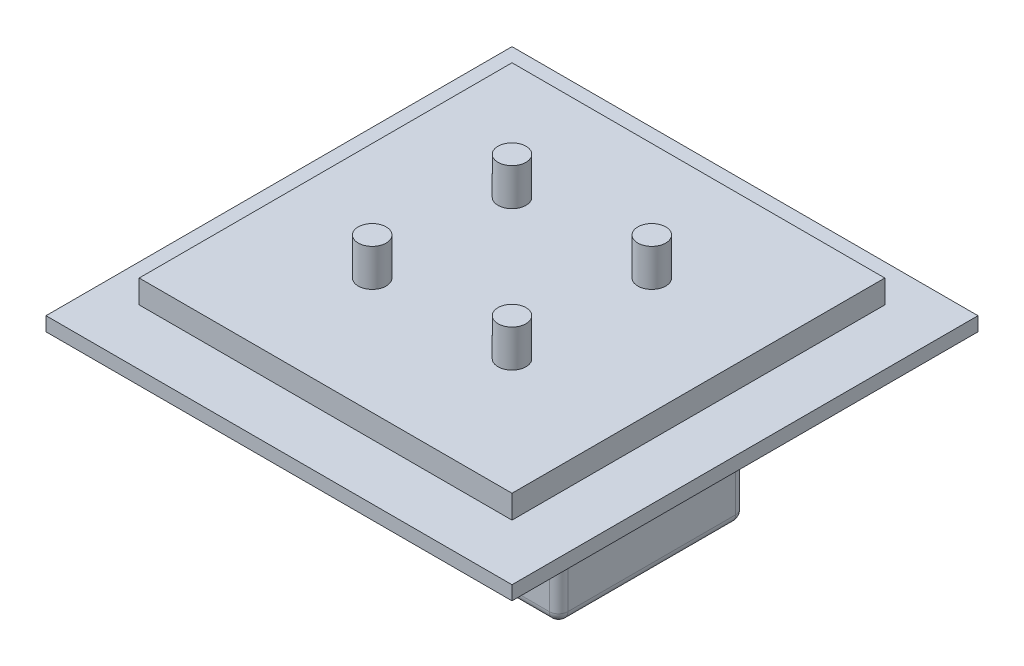
ISO-10303-21;
HEADER;
FILE_DESCRIPTION(('STEP AP214'),'2;1');
FILE_NAME('part.step','',(''),(''),'','','');
FILE_SCHEMA(('AUTOMOTIVE_DESIGN { 1 0 10303 214 1 1 1 1 }'));
ENDSEC;
DATA;
#1=APPLICATION_CONTEXT('core data for automotive mechanical design processes');
#2=APPLICATION_PROTOCOL_DEFINITION('international standard','automotive_design',2000,#1);
#3=PRODUCT_CONTEXT('',#1,'mechanical');
#4=PRODUCT('Part','Part','',(#3));
#5=PRODUCT_RELATED_PRODUCT_CATEGORY('part','',(#4));
#6=PRODUCT_DEFINITION_FORMATION('','',#4);
#7=PRODUCT_DEFINITION_CONTEXT('part definition',#1,'design');
#8=PRODUCT_DEFINITION('design','',#6,#7);
#9=PRODUCT_DEFINITION_SHAPE('','',#8);
#10=(LENGTH_UNIT() NAMED_UNIT(*) SI_UNIT(.MILLI.,.METRE.));
#11=(NAMED_UNIT(*) PLANE_ANGLE_UNIT() SI_UNIT($,.RADIAN.));
#12=(NAMED_UNIT(*) SI_UNIT($,.STERADIAN.) SOLID_ANGLE_UNIT());
#13=UNCERTAINTY_MEASURE_WITH_UNIT(LENGTH_MEASURE(1.E-05),#10,'distance_accuracy_value','');
#14=(GEOMETRIC_REPRESENTATION_CONTEXT(3) GLOBAL_UNCERTAINTY_ASSIGNED_CONTEXT((#13)) GLOBAL_UNIT_ASSIGNED_CONTEXT((#10,
#11,#12)) REPRESENTATION_CONTEXT('',''));
#15=CARTESIAN_POINT('',(0.,0.,0.));
#16=DIRECTION('',(0.,0.,1.));
#17=DIRECTION('',(1.,0.,0.));
#18=AXIS2_PLACEMENT_3D('',#15,#16,#17);
#19=CARTESIAN_POINT('',(0.,0.,-100.));
#20=DIRECTION('',(0.,-1.,0.));
#21=DIRECTION('',(1.,0.,0.));
#22=AXIS2_PLACEMENT_3D('',#19,#20,#21);
#23=PLANE('',#22);
#24=DIRECTION('',(0.,0.,1.));
#25=VECTOR('',#24,1.);
#26=CARTESIAN_POINT('',(30.,0.,-70.));
#27=LINE('',#26,#25);
#28=CARTESIAN_POINT('',(30.,0.,-68.));
#29=VERTEX_POINT('',#28);
#30=CARTESIAN_POINT('',(30.,0.,-32.));
#31=VERTEX_POINT('',#30);
#32=EDGE_CURVE('E394',#29,#31,#27,.T.);
#33=ORIENTED_EDGE('',*,*,#32,.F.);
#34=CARTESIAN_POINT('',(28.,0.,-68.));
#35=DIRECTION('',(0.,-1.,0.));
#36=DIRECTION('',(1.,0.,0.));
#37=AXIS2_PLACEMENT_3D('',#34,#35,#36);
#38=CIRCLE('',#37,2.);
#39=CARTESIAN_POINT('',(28.,0.,-70.));
#40=VERTEX_POINT('',#39);
#41=EDGE_CURVE('E341',#29,#40,#38,.F.);
#42=ORIENTED_EDGE('',*,*,#41,.T.);
#43=DIRECTION('',(1.,0.,0.));
#44=VECTOR('',#43,1.);
#45=CARTESIAN_POINT('',(-30.,0.,-70.));
#46=LINE('',#45,#44);
#47=CARTESIAN_POINT('',(-28.,0.,-70.));
#48=VERTEX_POINT('',#47);
#49=EDGE_CURVE('E410',#48,#40,#46,.T.);
#50=ORIENTED_EDGE('',*,*,#49,.F.);
#51=CARTESIAN_POINT('',(-28.,0.,-68.));
#52=DIRECTION('',(0.,-1.,0.));
#53=DIRECTION('',(1.,0.,0.));
#54=AXIS2_PLACEMENT_3D('',#51,#52,#53);
#55=CIRCLE('',#54,2.);
#56=CARTESIAN_POINT('',(-30.,0.,-68.));
#57=VERTEX_POINT('',#56);
#58=EDGE_CURVE('E51',#48,#57,#55,.F.);
#59=ORIENTED_EDGE('',*,*,#58,.T.);
#60=DIRECTION('',(0.,0.,-1.));
#61=VECTOR('',#60,1.);
#62=CARTESIAN_POINT('',(-30.,0.,-70.));
#63=LINE('',#62,#61);
#64=CARTESIAN_POINT('',(-30.,0.,-32.));
#65=VERTEX_POINT('',#64);
#66=EDGE_CURVE('E405',#65,#57,#63,.T.);
#67=ORIENTED_EDGE('',*,*,#66,.F.);
#68=CARTESIAN_POINT('',(-28.,0.,-32.));
#69=DIRECTION('',(0.,-1.,0.));
#70=DIRECTION('',(1.,0.,0.));
#71=AXIS2_PLACEMENT_3D('',#68,#69,#70);
#72=CIRCLE('',#71,2.);
#73=CARTESIAN_POINT('',(-28.,0.,-30.));
#74=VERTEX_POINT('',#73);
#75=EDGE_CURVE('E11',#65,#74,#72,.F.);
#76=ORIENTED_EDGE('',*,*,#75,.T.);
#77=DIRECTION('',(-1.,0.,0.));
#78=VECTOR('',#77,1.);
#79=CARTESIAN_POINT('',(-30.,0.,-30.));
#80=LINE('',#79,#78);
#81=CARTESIAN_POINT('',(28.,0.,-30.));
#82=VERTEX_POINT('',#81);
#83=EDGE_CURVE('E398',#82,#74,#80,.T.);
#84=ORIENTED_EDGE('',*,*,#83,.F.);
#85=CARTESIAN_POINT('',(28.,0.,-32.));
#86=DIRECTION('',(0.,-1.,0.));
#87=DIRECTION('',(1.,0.,0.));
#88=AXIS2_PLACEMENT_3D('',#85,#86,#87);
#89=CIRCLE('',#88,2.);
#90=EDGE_CURVE('E344',#82,#31,#89,.F.);
#91=ORIENTED_EDGE('',*,*,#90,.T.);
#92=EDGE_LOOP('',(#33,#42,#50,#59,#67,#76,#84,#91));
#93=FACE_BOUND('',#92,.T.);
#94=DIRECTION('',(1.,0.,0.));
#95=VECTOR('',#94,1.);
#96=CARTESIAN_POINT('',(0.,0.,0.));
#97=LINE('',#96,#95);
#98=CARTESIAN_POINT('',(-50.,0.,0.));
#99=VERTEX_POINT('',#98);
#100=CARTESIAN_POINT('',(50.,0.,0.));
#101=VERTEX_POINT('',#100);
#102=EDGE_CURVE('E239',#99,#101,#97,.T.);
#103=ORIENTED_EDGE('',*,*,#102,.F.);
#104=DIRECTION('',(0.,0.,1.));
#105=VECTOR('',#104,1.);
#106=CARTESIAN_POINT('',(-50.,0.,-100.));
#107=LINE('',#106,#105);
#108=CARTESIAN_POINT('',(-50.,0.,-100.));
#109=VERTEX_POINT('',#108);
#110=EDGE_CURVE('E265',#109,#99,#107,.T.);
#111=ORIENTED_EDGE('',*,*,#110,.F.);
#112=DIRECTION('',(1.,0.,0.));
#113=VECTOR('',#112,1.);
#114=CARTESIAN_POINT('',(0.,0.,-100.));
#115=LINE('',#114,#113);
#116=CARTESIAN_POINT('',(50.,0.,-100.));
#117=VERTEX_POINT('',#116);
#118=EDGE_CURVE('E234',#109,#117,#115,.T.);
#119=ORIENTED_EDGE('',*,*,#118,.T.);
#120=DIRECTION('',(0.,0.,1.));
#121=VECTOR('',#120,1.);
#122=CARTESIAN_POINT('',(50.,0.,-100.));
#123=LINE('',#122,#121);
#124=EDGE_CURVE('E251',#117,#101,#123,.T.);
#125=ORIENTED_EDGE('',*,*,#124,.T.);
#126=EDGE_LOOP('',(#103,#111,#119,#125));
#127=FACE_BOUND('',#126,.T.);
#128=ADVANCED_FACE('F41',(#93,#127),#23,.T.);
#129=CARTESIAN_POINT('',(-50.,0.,-100.));
#130=DIRECTION('',(-1.,0.,0.));
#131=DIRECTION('',(0.,0.,1.));
#132=AXIS2_PLACEMENT_3D('',#129,#130,#131);
#133=PLANE('',#132);
#134=DIRECTION('',(0.,-1.,0.));
#135=VECTOR('',#134,1.);
#136=CARTESIAN_POINT('',(-50.,0.,0.));
#137=LINE('',#136,#135);
#138=CARTESIAN_POINT('',(-50.,2.99999999999999,0.));
#139=VERTEX_POINT('',#138);
#140=EDGE_CURVE('E259',#139,#99,#137,.T.);
#141=ORIENTED_EDGE('',*,*,#140,.F.);
#142=DIRECTION('',(0.,0.,1.));
#143=VECTOR('',#142,1.);
#144=CARTESIAN_POINT('',(-50.,2.99999999999999,-100.));
#145=LINE('',#144,#143);
#146=CARTESIAN_POINT('',(-50.,2.99999999999999,-100.));
#147=VERTEX_POINT('',#146);
#148=EDGE_CURVE('E269',#147,#139,#145,.T.);
#149=ORIENTED_EDGE('',*,*,#148,.F.);
#150=DIRECTION('',(0.,-1.,0.));
#151=VECTOR('',#150,1.);
#152=CARTESIAN_POINT('',(-50.,0.,-100.));
#153=LINE('',#152,#151);
#154=EDGE_CURVE('E247',#147,#109,#153,.T.);
#155=ORIENTED_EDGE('',*,*,#154,.T.);
#156=ORIENTED_EDGE('',*,*,#110,.T.);
#157=EDGE_LOOP('',(#141,#149,#155,#156));
#158=FACE_BOUND('',#157,.T.);
#159=ADVANCED_FACE('F466',(#158),#133,.T.);
#160=CARTESIAN_POINT('',(-50.,2.99999999999999,-100.));
#161=DIRECTION('',(0.,1.,0.));
#162=DIRECTION('',(0.,0.,1.));
#163=AXIS2_PLACEMENT_3D('',#160,#161,#162);
#164=PLANE('',#163);
#165=CARTESIAN_POINT('',(30.,2.99999999999999,-20.));
#166=DIRECTION('',(0.,1.,0.));
#167=DIRECTION('',(0.,0.,1.));
#168=AXIS2_PLACEMENT_3D('',#165,#166,#167);
#169=CIRCLE('',#168,5.);
#170=CARTESIAN_POINT('',(30.,2.99999999999999,-15.));
#171=VERTEX_POINT('',#170);
#172=EDGE_CURVE('E195',#171,#171,#169,.T.);
#173=ORIENTED_EDGE('',*,*,#172,.F.);
#174=EDGE_LOOP('',(#173));
#175=FACE_BOUND('',#174,.T.);
#176=CARTESIAN_POINT('',(-30.,2.99999999999999,-20.));
#177=DIRECTION('',(0.,1.,0.));
#178=DIRECTION('',(0.,0.,1.));
#179=AXIS2_PLACEMENT_3D('',#176,#177,#178);
#180=CIRCLE('',#179,5.);
#181=CARTESIAN_POINT('',(-30.,2.99999999999999,-15.));
#182=VERTEX_POINT('',#181);
#183=EDGE_CURVE('E208',#182,#182,#180,.T.);
#184=ORIENTED_EDGE('',*,*,#183,.F.);
#185=EDGE_LOOP('',(#184));
#186=FACE_BOUND('',#185,.T.);
#187=CARTESIAN_POINT('',(30.,2.99999999999999,-80.));
#188=DIRECTION('',(0.,1.,0.));
#189=DIRECTION('',(0.,0.,1.));
#190=AXIS2_PLACEMENT_3D('',#187,#188,#189);
#191=CIRCLE('',#190,5.);
#192=CARTESIAN_POINT('',(30.,2.99999999999999,-75.));
#193=VERTEX_POINT('',#192);
#194=EDGE_CURVE('E214',#193,#193,#191,.T.);
#195=ORIENTED_EDGE('',*,*,#194,.F.);
#196=EDGE_LOOP('',(#195));
#197=FACE_BOUND('',#196,.T.);
#198=CARTESIAN_POINT('',(-30.,2.99999999999999,-80.));
#199=DIRECTION('',(0.,1.,0.));
#200=DIRECTION('',(0.,0.,1.));
#201=AXIS2_PLACEMENT_3D('',#198,#199,#200);
#202=CIRCLE('',#201,5.);
#203=CARTESIAN_POINT('',(-30.,2.99999999999999,-75.));
#204=VERTEX_POINT('',#203);
#205=EDGE_CURVE('E222',#204,#204,#202,.T.);
#206=ORIENTED_EDGE('',*,*,#205,.F.);
#207=EDGE_LOOP('',(#206));
#208=FACE_BOUND('',#207,.T.);
#209=DIRECTION('',(-1.,0.,0.));
#210=VECTOR('',#209,1.);
#211=CARTESIAN_POINT('',(-50.,2.99999999999999,0.));
#212=LINE('',#211,#210);
#213=CARTESIAN_POINT('',(50.,2.99999999999999,0.));
#214=VERTEX_POINT('',#213);
#215=EDGE_CURVE('E255',#214,#139,#212,.T.);
#216=ORIENTED_EDGE('',*,*,#215,.F.);
#217=DIRECTION('',(0.,0.,1.));
#218=VECTOR('',#217,1.);
#219=CARTESIAN_POINT('',(50.,2.99999999999999,-100.));
#220=LINE('',#219,#218);
#221=CARTESIAN_POINT('',(50.,2.99999999999999,-100.));
#222=VERTEX_POINT('',#221);
#223=EDGE_CURVE('E272',#222,#214,#220,.T.);
#224=ORIENTED_EDGE('',*,*,#223,.F.);
#225=DIRECTION('',(-1.,0.,0.));
#226=VECTOR('',#225,1.);
#227=CARTESIAN_POINT('',(-50.,2.99999999999999,-100.));
#228=LINE('',#227,#226);
#229=EDGE_CURVE('E243',#222,#147,#228,.T.);
#230=ORIENTED_EDGE('',*,*,#229,.T.);
#231=ORIENTED_EDGE('',*,*,#148,.T.);
#232=EDGE_LOOP('',(#216,#224,#230,#231));
#233=FACE_BOUND('',#232,.T.);
#234=ADVANCED_FACE('F474',(#175,#186,#197,#208,#233),#164,.T.);
#235=CARTESIAN_POINT('',(50.,2.99999999999999,-100.));
#236=DIRECTION('',(1.,0.,0.));
#237=DIRECTION('',(0.,0.,-1.));
#238=AXIS2_PLACEMENT_3D('',#235,#236,#237);
#239=PLANE('',#238);
#240=DIRECTION('',(0.,1.,0.));
#241=VECTOR('',#240,1.);
#242=CARTESIAN_POINT('',(50.,2.99999999999999,0.));
#243=LINE('',#242,#241);
#244=EDGE_CURVE('E230',#101,#214,#243,.T.);
#245=ORIENTED_EDGE('',*,*,#244,.F.);
#246=ORIENTED_EDGE('',*,*,#124,.F.);
#247=DIRECTION('',(0.,1.,0.));
#248=VECTOR('',#247,1.);
#249=CARTESIAN_POINT('',(50.,2.99999999999999,-100.));
#250=LINE('',#249,#248);
#251=EDGE_CURVE('E238',#117,#222,#250,.T.);
#252=ORIENTED_EDGE('',*,*,#251,.T.);
#253=ORIENTED_EDGE('',*,*,#223,.T.);
#254=EDGE_LOOP('',(#245,#246,#252,#253));
#255=FACE_BOUND('',#254,.T.);
#256=ADVANCED_FACE('F484',(#255),#239,.T.);
#257=CARTESIAN_POINT('',(0.,0.,-100.));
#258=DIRECTION('',(0.,0.,-1.));
#259=DIRECTION('',(-1.,0.,0.));
#260=AXIS2_PLACEMENT_3D('',#257,#258,#259);
#261=PLANE('',#260);
#262=ORIENTED_EDGE('',*,*,#118,.F.);
#263=ORIENTED_EDGE('',*,*,#154,.F.);
#264=ORIENTED_EDGE('',*,*,#229,.F.);
#265=ORIENTED_EDGE('',*,*,#251,.F.);
#266=EDGE_LOOP('',(#262,#263,#264,#265));
#267=FACE_BOUND('',#266,.T.);
#268=ADVANCED_FACE('F488',(#267),#261,.T.);
#269=CARTESIAN_POINT('',(0.,0.,0.));
#270=DIRECTION('',(0.,0.,-1.));
#271=DIRECTION('',(-1.,0.,0.));
#272=AXIS2_PLACEMENT_3D('',#269,#270,#271);
#273=PLANE('',#272);
#274=ORIENTED_EDGE('',*,*,#102,.T.);
#275=ORIENTED_EDGE('',*,*,#244,.T.);
#276=ORIENTED_EDGE('',*,*,#215,.T.);
#277=ORIENTED_EDGE('',*,*,#140,.T.);
#278=EDGE_LOOP('',(#274,#275,#276,#277));
#279=FACE_BOUND('',#278,.T.);
#280=ADVANCED_FACE('F479',(#279),#273,.F.);
#281=CARTESIAN_POINT('',(-30.,4.99999999999999,-80.));
#282=DIRECTION('',(0.,-1.,0.));
#283=DIRECTION('',(0.,0.,-1.));
#284=AXIS2_PLACEMENT_3D('',#281,#282,#283);
#285=CYLINDRICAL_SURFACE('',#284,5.);
#286=CARTESIAN_POINT('',(-30.,4.99999999999999,-80.));
#287=DIRECTION('',(0.,1.,0.));
#288=DIRECTION('',(0.,0.,1.));
#289=AXIS2_PLACEMENT_3D('',#286,#287,#288);
#290=CIRCLE('',#289,5.);
#291=CARTESIAN_POINT('',(-30.,4.99999999999999,-75.));
#292=VERTEX_POINT('',#291);
#293=EDGE_CURVE('E226',#292,#292,#290,.T.);
#294=ORIENTED_EDGE('',*,*,#293,.F.);
#295=EDGE_LOOP('',(#294));
#296=FACE_BOUND('',#295,.T.);
#297=ORIENTED_EDGE('',*,*,#205,.T.);
#298=EDGE_LOOP('',(#297));
#299=FACE_BOUND('',#298,.T.);
#300=ADVANCED_FACE('F658',(#296,#299),#285,.T.);
#301=CARTESIAN_POINT('',(30.,4.99999999999999,-80.));
#302=DIRECTION('',(0.,-1.,0.));
#303=DIRECTION('',(0.,0.,-1.));
#304=AXIS2_PLACEMENT_3D('',#301,#302,#303);
#305=CYLINDRICAL_SURFACE('',#304,5.);
#306=CARTESIAN_POINT('',(30.,4.99999999999999,-80.));
#307=DIRECTION('',(0.,1.,0.));
#308=DIRECTION('',(0.,0.,1.));
#309=AXIS2_PLACEMENT_3D('',#306,#307,#308);
#310=CIRCLE('',#309,5.);
#311=CARTESIAN_POINT('',(30.,4.99999999999999,-75.));
#312=VERTEX_POINT('',#311);
#313=EDGE_CURVE('E218',#312,#312,#310,.T.);
#314=ORIENTED_EDGE('',*,*,#313,.F.);
#315=EDGE_LOOP('',(#314));
#316=FACE_BOUND('',#315,.T.);
#317=ORIENTED_EDGE('',*,*,#194,.T.);
#318=EDGE_LOOP('',(#317));
#319=FACE_BOUND('',#318,.T.);
#320=ADVANCED_FACE('F662',(#316,#319),#305,.T.);
#321=CARTESIAN_POINT('',(-30.,4.99999999999999,-20.));
#322=DIRECTION('',(0.,-1.,0.));
#323=DIRECTION('',(0.,0.,-1.));
#324=AXIS2_PLACEMENT_3D('',#321,#322,#323);
#325=CYLINDRICAL_SURFACE('',#324,5.);
#326=CARTESIAN_POINT('',(-30.,4.99999999999999,-20.));
#327=DIRECTION('',(0.,1.,0.));
#328=DIRECTION('',(0.,0.,1.));
#329=AXIS2_PLACEMENT_3D('',#326,#327,#328);
#330=CIRCLE('',#329,5.);
#331=CARTESIAN_POINT('',(-30.,4.99999999999999,-15.));
#332=VERTEX_POINT('',#331);
#333=EDGE_CURVE('E210',#332,#332,#330,.T.);
#334=ORIENTED_EDGE('',*,*,#333,.F.);
#335=EDGE_LOOP('',(#334));
#336=FACE_BOUND('',#335,.T.);
#337=ORIENTED_EDGE('',*,*,#183,.T.);
#338=EDGE_LOOP('',(#337));
#339=FACE_BOUND('',#338,.T.);
#340=ADVANCED_FACE('F634',(#336,#339),#325,.T.);
#341=CARTESIAN_POINT('',(30.,4.99999999999999,-20.));
#342=DIRECTION('',(0.,-1.,0.));
#343=DIRECTION('',(0.,0.,-1.));
#344=AXIS2_PLACEMENT_3D('',#341,#342,#343);
#345=CYLINDRICAL_SURFACE('',#344,5.);
#346=CARTESIAN_POINT('',(30.,4.99999999999999,-20.));
#347=DIRECTION('',(0.,1.,0.));
#348=DIRECTION('',(0.,0.,1.));
#349=AXIS2_PLACEMENT_3D('',#346,#347,#348);
#350=CIRCLE('',#349,5.);
#351=CARTESIAN_POINT('',(30.,4.99999999999999,-15.));
#352=VERTEX_POINT('',#351);
#353=EDGE_CURVE('E200',#352,#352,#350,.T.);
#354=ORIENTED_EDGE('',*,*,#353,.F.);
#355=EDGE_LOOP('',(#354));
#356=FACE_BOUND('',#355,.T.);
#357=ORIENTED_EDGE('',*,*,#172,.T.);
#358=EDGE_LOOP('',(#357));
#359=FACE_BOUND('',#358,.T.);
#360=ADVANCED_FACE('F631',(#356,#359),#345,.T.);
#361=CARTESIAN_POINT('',(40.,9.99999999999999,-10.));
#362=DIRECTION('',(-1.,0.,0.));
#363=DIRECTION('',(0.,0.,1.));
#364=AXIS2_PLACEMENT_3D('',#361,#362,#363);
#365=PLANE('',#364);
#366=DIRECTION('',(0.,0.,-1.));
#367=VECTOR('',#366,1.);
#368=CARTESIAN_POINT('',(40.,4.99999999999999,-10.));
#369=LINE('',#368,#367);
#370=CARTESIAN_POINT('',(40.,4.99999999999999,-10.));
#371=VERTEX_POINT('',#370);
#372=CARTESIAN_POINT('',(40.,4.99999999999999,-90.));
#373=VERTEX_POINT('',#372);
#374=EDGE_CURVE('E193',#371,#373,#369,.T.);
#375=ORIENTED_EDGE('',*,*,#374,.T.);
#376=DIRECTION('',(0.,-1.,0.));
#377=VECTOR('',#376,1.);
#378=CARTESIAN_POINT('',(40.,9.99999999999999,-90.));
#379=LINE('',#378,#377);
#380=CARTESIAN_POINT('',(40.,9.99999999999999,-90.));
#381=VERTEX_POINT('',#380);
#382=EDGE_CURVE('E171',#381,#373,#379,.T.);
#383=ORIENTED_EDGE('',*,*,#382,.F.);
#384=DIRECTION('',(0.,0.,-1.));
#385=VECTOR('',#384,1.);
#386=CARTESIAN_POINT('',(40.,9.99999999999999,-10.));
#387=LINE('',#386,#385);
#388=CARTESIAN_POINT('',(40.,9.99999999999999,-10.));
#389=VERTEX_POINT('',#388);
#390=EDGE_CURVE('E179',#389,#381,#387,.T.);
#391=ORIENTED_EDGE('',*,*,#390,.F.);
#392=DIRECTION('',(0.,-1.,0.));
#393=VECTOR('',#392,1.);
#394=CARTESIAN_POINT('',(40.,9.99999999999999,-10.));
#395=LINE('',#394,#393);
#396=EDGE_CURVE('E434',#389,#371,#395,.T.);
#397=ORIENTED_EDGE('',*,*,#396,.T.);
#398=EDGE_LOOP('',(#375,#383,#391,#397));
#399=FACE_BOUND('',#398,.T.);
#400=ADVANCED_FACE('F191',(#399),#365,.F.);
#401=CARTESIAN_POINT('',(-40.,9.99999999999999,-90.));
#402=DIRECTION('',(0.,0.,1.));
#403=DIRECTION('',(1.,0.,0.));
#404=AXIS2_PLACEMENT_3D('',#401,#402,#403);
#405=PLANE('',#404);
#406=DIRECTION('',(-1.,0.,0.));
#407=VECTOR('',#406,1.);
#408=CARTESIAN_POINT('',(-40.,4.99999999999999,-90.));
#409=LINE('',#408,#407);
#410=CARTESIAN_POINT('',(-40.,4.99999999999999,-90.));
#411=VERTEX_POINT('',#410);
#412=EDGE_CURVE('E437',#373,#411,#409,.T.);
#413=ORIENTED_EDGE('',*,*,#412,.T.);
#414=DIRECTION('',(0.,-1.,0.));
#415=VECTOR('',#414,1.);
#416=CARTESIAN_POINT('',(-40.,9.99999999999999,-90.));
#417=LINE('',#416,#415);
#418=CARTESIAN_POINT('',(-40.,9.99999999999999,-90.));
#419=VERTEX_POINT('',#418);
#420=EDGE_CURVE('E174',#419,#411,#417,.T.);
#421=ORIENTED_EDGE('',*,*,#420,.F.);
#422=DIRECTION('',(-1.,0.,0.));
#423=VECTOR('',#422,1.);
#424=CARTESIAN_POINT('',(-40.,9.99999999999999,-90.));
#425=LINE('',#424,#423);
#426=EDGE_CURVE('E167',#381,#419,#425,.T.);
#427=ORIENTED_EDGE('',*,*,#426,.F.);
#428=ORIENTED_EDGE('',*,*,#382,.T.);
#429=EDGE_LOOP('',(#413,#421,#427,#428));
#430=FACE_BOUND('',#429,.T.);
#431=ADVANCED_FACE('F169',(#430),#405,.F.);
#432=CARTESIAN_POINT('',(-40.,9.99999999999999,-10.));
#433=DIRECTION('',(1.,0.,0.));
#434=DIRECTION('',(0.,0.,-1.));
#435=AXIS2_PLACEMENT_3D('',#432,#433,#434);
#436=PLANE('',#435);
#437=DIRECTION('',(0.,0.,1.));
#438=VECTOR('',#437,1.);
#439=CARTESIAN_POINT('',(-40.,4.99999999999999,-10.));
#440=LINE('',#439,#438);
#441=CARTESIAN_POINT('',(-40.,4.99999999999999,-10.));
#442=VERTEX_POINT('',#441);
#443=EDGE_CURVE('E440',#411,#442,#440,.T.);
#444=ORIENTED_EDGE('',*,*,#443,.T.);
#445=DIRECTION('',(0.,-1.,0.));
#446=VECTOR('',#445,1.);
#447=CARTESIAN_POINT('',(-40.,9.99999999999999,-10.));
#448=LINE('',#447,#446);
#449=CARTESIAN_POINT('',(-40.,9.99999999999999,-10.));
#450=VERTEX_POINT('',#449);
#451=EDGE_CURVE('E202',#450,#442,#448,.T.);
#452=ORIENTED_EDGE('',*,*,#451,.F.);
#453=DIRECTION('',(0.,0.,1.));
#454=VECTOR('',#453,1.);
#455=CARTESIAN_POINT('',(-40.,9.99999999999999,-10.));
#456=LINE('',#455,#454);
#457=EDGE_CURVE('E178',#419,#450,#456,.T.);
#458=ORIENTED_EDGE('',*,*,#457,.F.);
#459=ORIENTED_EDGE('',*,*,#420,.T.);
#460=EDGE_LOOP('',(#444,#452,#458,#459));
#461=FACE_BOUND('',#460,.T.);
#462=ADVANCED_FACE('F456',(#461),#436,.F.);
#463=CARTESIAN_POINT('',(-40.,9.99999999999999,-10.));
#464=DIRECTION('',(0.,0.,-1.));
#465=DIRECTION('',(-1.,0.,0.));
#466=AXIS2_PLACEMENT_3D('',#463,#464,#465);
#467=PLANE('',#466);
#468=DIRECTION('',(1.,0.,0.));
#469=VECTOR('',#468,1.);
#470=CARTESIAN_POINT('',(-40.,4.99999999999999,-10.));
#471=LINE('',#470,#469);
#472=EDGE_CURVE('E189',#442,#371,#471,.T.);
#473=ORIENTED_EDGE('',*,*,#472,.T.);
#474=ORIENTED_EDGE('',*,*,#396,.F.);
#475=DIRECTION('',(1.,0.,0.));
#476=VECTOR('',#475,1.);
#477=CARTESIAN_POINT('',(-40.,9.99999999999999,-10.));
#478=LINE('',#477,#476);
#479=EDGE_CURVE('E184',#450,#389,#478,.T.);
#480=ORIENTED_EDGE('',*,*,#479,.F.);
#481=ORIENTED_EDGE('',*,*,#451,.T.);
#482=EDGE_LOOP('',(#473,#474,#480,#481));
#483=FACE_BOUND('',#482,.T.);
#484=ADVANCED_FACE('F451',(#483),#467,.F.);
#485=CARTESIAN_POINT('',(0.,9.99999999999999,0.));
#486=DIRECTION('',(0.,-1.,0.));
#487=DIRECTION('',(0.,0.,-1.));
#488=AXIS2_PLACEMENT_3D('',#485,#486,#487);
#489=PLANE('',#488);
#490=CARTESIAN_POINT('',(15.,9.99999999999999,-35.));
#491=DIRECTION('',(0.,-1.,0.));
#492=DIRECTION('',(0.,0.,-1.));
#493=AXIS2_PLACEMENT_3D('',#490,#491,#492);
#494=CIRCLE('',#493,3.);
#495=CARTESIAN_POINT('',(15.,9.99999999999999,-38.));
#496=VERTEX_POINT('',#495);
#497=EDGE_CURVE('E289',#496,#496,#494,.F.);
#498=ORIENTED_EDGE('',*,*,#497,.F.);
#499=EDGE_LOOP('',(#498));
#500=FACE_BOUND('',#499,.T.);
#501=CARTESIAN_POINT('',(-15.,9.99999999999999,-35.));
#502=DIRECTION('',(0.,-1.,0.));
#503=DIRECTION('',(0.,0.,-1.));
#504=AXIS2_PLACEMENT_3D('',#501,#502,#503);
#505=CIRCLE('',#504,3.);
#506=CARTESIAN_POINT('',(-15.,9.99999999999999,-38.));
#507=VERTEX_POINT('',#506);
#508=EDGE_CURVE('E285',#507,#507,#505,.F.);
#509=ORIENTED_EDGE('',*,*,#508,.F.);
#510=EDGE_LOOP('',(#509));
#511=FACE_BOUND('',#510,.T.);
#512=CARTESIAN_POINT('',(15.,9.99999999999999,-65.));
#513=DIRECTION('',(0.,-1.,0.));
#514=DIRECTION('',(0.,0.,-1.));
#515=AXIS2_PLACEMENT_3D('',#512,#513,#514);
#516=CIRCLE('',#515,3.);
#517=CARTESIAN_POINT('',(15.,9.99999999999999,-68.));
#518=VERTEX_POINT('',#517);
#519=EDGE_CURVE('E281',#518,#518,#516,.F.);
#520=ORIENTED_EDGE('',*,*,#519,.F.);
#521=EDGE_LOOP('',(#520));
#522=FACE_BOUND('',#521,.T.);
#523=CARTESIAN_POINT('',(-15.,9.99999999999999,-65.));
#524=DIRECTION('',(0.,-1.,0.));
#525=DIRECTION('',(0.,0.,-1.));
#526=AXIS2_PLACEMENT_3D('',#523,#524,#525);
#527=CIRCLE('',#526,3.);
#528=CARTESIAN_POINT('',(-15.,9.99999999999999,-68.));
#529=VERTEX_POINT('',#528);
#530=EDGE_CURVE('E268',#529,#529,#527,.F.);
#531=ORIENTED_EDGE('',*,*,#530,.F.);
#532=EDGE_LOOP('',(#531));
#533=FACE_BOUND('',#532,.T.);
#534=ORIENTED_EDGE('',*,*,#390,.T.);
#535=ORIENTED_EDGE('',*,*,#426,.T.);
#536=ORIENTED_EDGE('',*,*,#457,.T.);
#537=ORIENTED_EDGE('',*,*,#479,.T.);
#538=EDGE_LOOP('',(#534,#535,#536,#537));
#539=FACE_BOUND('',#538,.T.);
#540=ADVANCED_FACE('F182',(#500,#511,#522,#533,#539),#489,.F.);
#541=CARTESIAN_POINT('',(0.,4.99999999999999,0.));
#542=DIRECTION('',(0.,-1.,0.));
#543=DIRECTION('',(0.,0.,-1.));
#544=AXIS2_PLACEMENT_3D('',#541,#542,#543);
#545=PLANE('',#544);
#546=ORIENTED_EDGE('',*,*,#293,.T.);
#547=EDGE_LOOP('',(#546));
#548=FACE_BOUND('',#547,.T.);
#549=ORIENTED_EDGE('',*,*,#313,.T.);
#550=EDGE_LOOP('',(#549));
#551=FACE_BOUND('',#550,.T.);
#552=ORIENTED_EDGE('',*,*,#333,.T.);
#553=EDGE_LOOP('',(#552));
#554=FACE_BOUND('',#553,.T.);
#555=ORIENTED_EDGE('',*,*,#353,.T.);
#556=EDGE_LOOP('',(#555));
#557=FACE_BOUND('',#556,.T.);
#558=ORIENTED_EDGE('',*,*,#374,.F.);
#559=ORIENTED_EDGE('',*,*,#472,.F.);
#560=ORIENTED_EDGE('',*,*,#443,.F.);
#561=ORIENTED_EDGE('',*,*,#412,.F.);
#562=EDGE_LOOP('',(#558,#559,#560,#561));
#563=FACE_BOUND('',#562,.T.);
#564=ADVANCED_FACE('F455',(#548,#551,#554,#557,#563),#545,.T.);
#565=CARTESIAN_POINT('',(-15.,18.,-65.));
#566=DIRECTION('',(0.,-1.,0.));
#567=DIRECTION('',(0.,0.,-1.));
#568=AXIS2_PLACEMENT_3D('',#565,#566,#567);
#569=CYLINDRICAL_SURFACE('',#568,3.);
#570=CARTESIAN_POINT('',(-15.,18.,-65.));
#571=DIRECTION('',(0.,1.,0.));
#572=DIRECTION('',(0.,0.,1.));
#573=AXIS2_PLACEMENT_3D('',#570,#571,#572);
#574=CIRCLE('',#573,3.);
#575=CARTESIAN_POINT('',(-15.,18.,-62.));
#576=VERTEX_POINT('',#575);
#577=EDGE_CURVE('E426',#576,#576,#574,.T.);
#578=ORIENTED_EDGE('',*,*,#577,.F.);
#579=EDGE_LOOP('',(#578));
#580=FACE_BOUND('',#579,.T.);
#581=ORIENTED_EDGE('',*,*,#530,.T.);
#582=EDGE_LOOP('',(#581));
#583=FACE_BOUND('',#582,.T.);
#584=ADVANCED_FACE('F611',(#580,#583),#569,.T.);
#585=CARTESIAN_POINT('',(-15.,18.,-65.));
#586=DIRECTION('',(0.,1.,0.));
#587=DIRECTION('',(0.,0.,1.));
#588=AXIS2_PLACEMENT_3D('',#585,#586,#587);
#589=PLANE('',#588);
#590=ORIENTED_EDGE('',*,*,#577,.T.);
#591=EDGE_LOOP('',(#590));
#592=FACE_BOUND('',#591,.T.);
#593=ADVANCED_FACE('F607',(#592),#589,.T.);
#594=CARTESIAN_POINT('',(15.,18.,-65.));
#595=DIRECTION('',(0.,-1.,0.));
#596=DIRECTION('',(0.,0.,-1.));
#597=AXIS2_PLACEMENT_3D('',#594,#595,#596);
#598=CYLINDRICAL_SURFACE('',#597,3.);
#599=CARTESIAN_POINT('',(15.,18.,-65.));
#600=DIRECTION('',(0.,1.,0.));
#601=DIRECTION('',(0.,0.,1.));
#602=AXIS2_PLACEMENT_3D('',#599,#600,#601);
#603=CIRCLE('',#602,3.);
#604=CARTESIAN_POINT('',(15.,18.,-62.));
#605=VERTEX_POINT('',#604);
#606=EDGE_CURVE('E422',#605,#605,#603,.T.);
#607=ORIENTED_EDGE('',*,*,#606,.F.);
#608=EDGE_LOOP('',(#607));
#609=FACE_BOUND('',#608,.T.);
#610=ORIENTED_EDGE('',*,*,#519,.T.);
#611=EDGE_LOOP('',(#610));
#612=FACE_BOUND('',#611,.T.);
#613=ADVANCED_FACE('F603',(#609,#612),#598,.T.);
#614=CARTESIAN_POINT('',(15.,18.,-65.));
#615=DIRECTION('',(0.,1.,0.));
#616=DIRECTION('',(0.,0.,1.));
#617=AXIS2_PLACEMENT_3D('',#614,#615,#616);
#618=PLANE('',#617);
#619=ORIENTED_EDGE('',*,*,#606,.T.);
#620=EDGE_LOOP('',(#619));
#621=FACE_BOUND('',#620,.T.);
#622=ADVANCED_FACE('F599',(#621),#618,.T.);
#623=CARTESIAN_POINT('',(-15.,18.,-35.));
#624=DIRECTION('',(0.,-1.,0.));
#625=DIRECTION('',(0.,0.,-1.));
#626=AXIS2_PLACEMENT_3D('',#623,#624,#625);
#627=CYLINDRICAL_SURFACE('',#626,3.);
#628=CARTESIAN_POINT('',(-15.,18.,-35.));
#629=DIRECTION('',(0.,1.,0.));
#630=DIRECTION('',(0.,0.,1.));
#631=AXIS2_PLACEMENT_3D('',#628,#629,#630);
#632=CIRCLE('',#631,3.);
#633=CARTESIAN_POINT('',(-15.,18.,-32.));
#634=VERTEX_POINT('',#633);
#635=EDGE_CURVE('E418',#634,#634,#632,.T.);
#636=ORIENTED_EDGE('',*,*,#635,.F.);
#637=EDGE_LOOP('',(#636));
#638=FACE_BOUND('',#637,.T.);
#639=ORIENTED_EDGE('',*,*,#508,.T.);
#640=EDGE_LOOP('',(#639));
#641=FACE_BOUND('',#640,.T.);
#642=ADVANCED_FACE('F595',(#638,#641),#627,.T.);
#643=CARTESIAN_POINT('',(-15.,18.,-35.));
#644=DIRECTION('',(0.,1.,0.));
#645=DIRECTION('',(0.,0.,1.));
#646=AXIS2_PLACEMENT_3D('',#643,#644,#645);
#647=PLANE('',#646);
#648=ORIENTED_EDGE('',*,*,#635,.T.);
#649=EDGE_LOOP('',(#648));
#650=FACE_BOUND('',#649,.T.);
#651=ADVANCED_FACE('F591',(#650),#647,.T.);
#652=CARTESIAN_POINT('',(15.,18.,-35.));
#653=DIRECTION('',(0.,-1.,0.));
#654=DIRECTION('',(0.,0.,-1.));
#655=AXIS2_PLACEMENT_3D('',#652,#653,#654);
#656=CYLINDRICAL_SURFACE('',#655,3.);
#657=CARTESIAN_POINT('',(15.,18.,-35.));
#658=DIRECTION('',(0.,1.,0.));
#659=DIRECTION('',(0.,0.,1.));
#660=AXIS2_PLACEMENT_3D('',#657,#658,#659);
#661=CIRCLE('',#660,3.);
#662=CARTESIAN_POINT('',(15.,18.,-32.));
#663=VERTEX_POINT('',#662);
#664=EDGE_CURVE('E414',#663,#663,#661,.T.);
#665=ORIENTED_EDGE('',*,*,#664,.F.);
#666=EDGE_LOOP('',(#665));
#667=FACE_BOUND('',#666,.T.);
#668=ORIENTED_EDGE('',*,*,#497,.T.);
#669=EDGE_LOOP('',(#668));
#670=FACE_BOUND('',#669,.T.);
#671=ADVANCED_FACE('F587',(#667,#670),#656,.T.);
#672=CARTESIAN_POINT('',(15.,18.,-35.));
#673=DIRECTION('',(0.,1.,0.));
#674=DIRECTION('',(0.,0.,1.));
#675=AXIS2_PLACEMENT_3D('',#672,#673,#674);
#676=PLANE('',#675);
#677=ORIENTED_EDGE('',*,*,#664,.T.);
#678=EDGE_LOOP('',(#677));
#679=FACE_BOUND('',#678,.T.);
#680=ADVANCED_FACE('F584',(#679),#676,.T.);
#681=CARTESIAN_POINT('',(30.,-30.,-70.));
#682=DIRECTION('',(-1.,0.,0.));
#683=DIRECTION('',(0.,-1.,0.));
#684=AXIS2_PLACEMENT_3D('',#681,#682,#683);
#685=PLANE('',#684);
#686=DIRECTION('',(0.,0.,1.));
#687=VECTOR('',#686,1.);
#688=CARTESIAN_POINT('',(30.,-28.,-70.));
#689=LINE('',#688,#687);
#690=CARTESIAN_POINT('',(30.,-28.,-32.));
#691=VERTEX_POINT('',#690);
#692=CARTESIAN_POINT('',(30.,-28.,-68.));
#693=VERTEX_POINT('',#692);
#694=EDGE_CURVE('E319',#691,#693,#689,.F.);
#695=ORIENTED_EDGE('',*,*,#694,.T.);
#696=DIRECTION('',(0.,1.,0.));
#697=VECTOR('',#696,1.);
#698=CARTESIAN_POINT('',(30.,-30.,-68.));
#699=LINE('',#698,#697);
#700=EDGE_CURVE('E322',#693,#29,#699,.T.);
#701=ORIENTED_EDGE('',*,*,#700,.T.);
#702=ORIENTED_EDGE('',*,*,#32,.T.);
#703=DIRECTION('',(0.,1.,0.));
#704=VECTOR('',#703,1.);
#705=CARTESIAN_POINT('',(30.,-30.,-32.));
#706=LINE('',#705,#704);
#707=EDGE_CURVE('E316',#31,#691,#706,.F.);
#708=ORIENTED_EDGE('',*,*,#707,.T.);
#709=EDGE_LOOP('',(#695,#701,#702,#708));
#710=FACE_BOUND('',#709,.T.);
#711=ADVANCED_FACE('F562',(#710),#685,.F.);
#712=CARTESIAN_POINT('',(-30.,-30.,-30.));
#713=DIRECTION('',(0.,0.,-1.));
#714=DIRECTION('',(-1.,0.,0.));
#715=AXIS2_PLACEMENT_3D('',#712,#713,#714);
#716=PLANE('',#715);
#717=DIRECTION('',(-1.,0.,0.));
#718=VECTOR('',#717,1.);
#719=CARTESIAN_POINT('',(-30.,-28.,-30.));
#720=LINE('',#719,#718);
#721=CARTESIAN_POINT('',(-28.,-28.,-30.));
#722=VERTEX_POINT('',#721);
#723=CARTESIAN_POINT('',(28.,-28.,-30.));
#724=VERTEX_POINT('',#723);
#725=EDGE_CURVE('E328',#722,#724,#720,.F.);
#726=ORIENTED_EDGE('',*,*,#725,.T.);
#727=DIRECTION('',(0.,1.,0.));
#728=VECTOR('',#727,1.);
#729=CARTESIAN_POINT('',(28.,-30.,-30.));
#730=LINE('',#729,#728);
#731=EDGE_CURVE('E331',#724,#82,#730,.T.);
#732=ORIENTED_EDGE('',*,*,#731,.T.);
#733=ORIENTED_EDGE('',*,*,#83,.T.);
#734=DIRECTION('',(0.,1.,0.));
#735=VECTOR('',#734,1.);
#736=CARTESIAN_POINT('',(-28.,-30.,-30.));
#737=LINE('',#736,#735);
#738=EDGE_CURVE('E325',#74,#722,#737,.F.);
#739=ORIENTED_EDGE('',*,*,#738,.T.);
#740=EDGE_LOOP('',(#726,#732,#733,#739));
#741=FACE_BOUND('',#740,.T.);
#742=ADVANCED_FACE('F546',(#741),#716,.F.);
#743=CARTESIAN_POINT('',(-30.,-30.,-70.));
#744=DIRECTION('',(1.,0.,0.));
#745=DIRECTION('',(0.,1.,0.));
#746=AXIS2_PLACEMENT_3D('',#743,#744,#745);
#747=PLANE('',#746);
#748=ORIENTED_EDGE('',*,*,#66,.T.);
#749=DIRECTION('',(0.,1.,0.));
#750=VECTOR('',#749,1.);
#751=CARTESIAN_POINT('',(-30.,-30.,-68.));
#752=LINE('',#751,#750);
#753=CARTESIAN_POINT('',(-30.,-28.,-68.));
#754=VERTEX_POINT('',#753);
#755=EDGE_CURVE('E59',#57,#754,#752,.F.);
#756=ORIENTED_EDGE('',*,*,#755,.T.);
#757=DIRECTION('',(0.,0.,-1.));
#758=VECTOR('',#757,1.);
#759=CARTESIAN_POINT('',(-30.,-28.,-70.));
#760=LINE('',#759,#758);
#761=CARTESIAN_POINT('',(-30.,-28.,-32.));
#762=VERTEX_POINT('',#761);
#763=EDGE_CURVE('E63',#754,#762,#760,.F.);
#764=ORIENTED_EDGE('',*,*,#763,.T.);
#765=DIRECTION('',(0.,1.,0.));
#766=VECTOR('',#765,1.);
#767=CARTESIAN_POINT('',(-30.,-30.,-32.));
#768=LINE('',#767,#766);
#769=EDGE_CURVE('E334',#762,#65,#768,.T.);
#770=ORIENTED_EDGE('',*,*,#769,.T.);
#771=EDGE_LOOP('',(#748,#756,#764,#770));
#772=FACE_BOUND('',#771,.T.);
#773=ADVANCED_FACE('F550',(#772),#747,.F.);
#774=CARTESIAN_POINT('',(-30.,-30.,-70.));
#775=DIRECTION('',(0.,0.,1.));
#776=DIRECTION('',(1.,0.,0.));
#777=AXIS2_PLACEMENT_3D('',#774,#775,#776);
#778=PLANE('',#777);
#779=ORIENTED_EDGE('',*,*,#49,.T.);
#780=DIRECTION('',(0.,1.,0.));
#781=VECTOR('',#780,1.);
#782=CARTESIAN_POINT('',(28.,-30.,-70.));
#783=LINE('',#782,#781);
#784=CARTESIAN_POINT('',(28.,-28.,-70.));
#785=VERTEX_POINT('',#784);
#786=EDGE_CURVE('E313',#40,#785,#783,.F.);
#787=ORIENTED_EDGE('',*,*,#786,.T.);
#788=DIRECTION('',(1.,0.,0.));
#789=VECTOR('',#788,1.);
#790=CARTESIAN_POINT('',(-30.,-28.,-70.));
#791=LINE('',#790,#789);
#792=CARTESIAN_POINT('',(-28.,-28.,-70.));
#793=VERTEX_POINT('',#792);
#794=EDGE_CURVE('E309',#785,#793,#791,.F.);
#795=ORIENTED_EDGE('',*,*,#794,.T.);
#796=DIRECTION('',(0.,1.,0.));
#797=VECTOR('',#796,1.);
#798=CARTESIAN_POINT('',(-28.,-30.,-70.));
#799=LINE('',#798,#797);
#800=EDGE_CURVE('E306',#793,#48,#799,.T.);
#801=ORIENTED_EDGE('',*,*,#800,.T.);
#802=EDGE_LOOP('',(#779,#787,#795,#801));
#803=FACE_BOUND('',#802,.T.);
#804=ADVANCED_FACE('F569',(#803),#778,.F.);
#805=CARTESIAN_POINT('',(0.,-30.,0.));
#806=DIRECTION('',(0.,1.,0.));
#807=DIRECTION('',(-1.,0.,0.));
#808=AXIS2_PLACEMENT_3D('',#805,#806,#807);
#809=PLANE('',#808);
#810=DIRECTION('',(0.,0.,-1.));
#811=VECTOR('',#810,1.);
#812=CARTESIAN_POINT('',(-28.,-30.,0.));
#813=LINE('',#812,#811);
#814=CARTESIAN_POINT('',(-28.,-30.,-32.));
#815=VERTEX_POINT('',#814);
#816=CARTESIAN_POINT('',(-28.,-30.,-68.));
#817=VERTEX_POINT('',#816);
#818=EDGE_CURVE('E296',#815,#817,#813,.T.);
#819=ORIENTED_EDGE('',*,*,#818,.T.);
#820=DIRECTION('',(1.,0.,0.));
#821=VECTOR('',#820,1.);
#822=CARTESIAN_POINT('',(0.,-30.,-68.));
#823=LINE('',#822,#821);
#824=CARTESIAN_POINT('',(28.,-30.,-68.));
#825=VERTEX_POINT('',#824);
#826=EDGE_CURVE('E302',#817,#825,#823,.T.);
#827=ORIENTED_EDGE('',*,*,#826,.T.);
#828=DIRECTION('',(0.,0.,1.));
#829=VECTOR('',#828,1.);
#830=CARTESIAN_POINT('',(28.,-30.,0.));
#831=LINE('',#830,#829);
#832=CARTESIAN_POINT('',(28.,-30.,-32.));
#833=VERTEX_POINT('',#832);
#834=EDGE_CURVE('E299',#825,#833,#831,.T.);
#835=ORIENTED_EDGE('',*,*,#834,.T.);
#836=DIRECTION('',(-1.,0.,0.));
#837=VECTOR('',#836,1.);
#838=CARTESIAN_POINT('',(0.,-30.,-32.));
#839=LINE('',#838,#837);
#840=EDGE_CURVE('E293',#833,#815,#839,.T.);
#841=ORIENTED_EDGE('',*,*,#840,.T.);
#842=EDGE_LOOP('',(#819,#827,#835,#841));
#843=FACE_BOUND('',#842,.T.);
#844=ADVANCED_FACE('F534',(#843),#809,.F.);
#845=CARTESIAN_POINT('',(-28.,-30.,-32.));
#846=DIRECTION('',(0.,1.,0.));
#847=DIRECTION('',(-1.,0.,0.));
#848=AXIS2_PLACEMENT_3D('',#845,#846,#847);
#849=CYLINDRICAL_SURFACE('',#848,2.);
#850=ORIENTED_EDGE('',*,*,#75,.F.);
#851=ORIENTED_EDGE('',*,*,#769,.F.);
#852=CARTESIAN_POINT('',(-28.,-28.,-32.));
#853=DIRECTION('',(0.,-1.,0.));
#854=DIRECTION('',(0.,0.,-1.));
#855=AXIS2_PLACEMENT_3D('',#852,#853,#854);
#856=CIRCLE('',#855,2.);
#857=EDGE_CURVE('E45',#722,#762,#856,.T.);
#858=ORIENTED_EDGE('',*,*,#857,.F.);
#859=ORIENTED_EDGE('',*,*,#738,.F.);
#860=EDGE_LOOP('',(#850,#851,#858,#859));
#861=FACE_BOUND('',#860,.T.);
#862=ADVANCED_FACE('F43',(#861),#849,.T.);
#863=CARTESIAN_POINT('',(0.,-28.,-32.));
#864=DIRECTION('',(-1.,0.,0.));
#865=DIRECTION('',(0.,-1.,0.));
#866=AXIS2_PLACEMENT_3D('',#863,#864,#865);
#867=CYLINDRICAL_SURFACE('',#866,2.);
#868=CARTESIAN_POINT('',(28.,-28.,-32.));
#869=DIRECTION('',(1.,0.,0.));
#870=DIRECTION('',(0.,1.,0.));
#871=AXIS2_PLACEMENT_3D('',#868,#869,#870);
#872=CIRCLE('',#871,2.);
#873=EDGE_CURVE('E383',#724,#833,#872,.T.);
#874=ORIENTED_EDGE('',*,*,#873,.F.);
#875=ORIENTED_EDGE('',*,*,#725,.F.);
#876=CARTESIAN_POINT('',(-28.,-28.,-32.));
#877=DIRECTION('',(-1.,0.,0.));
#878=DIRECTION('',(0.,0.,1.));
#879=AXIS2_PLACEMENT_3D('',#876,#877,#878);
#880=CIRCLE('',#879,2.);
#881=EDGE_CURVE('E386',#815,#722,#880,.T.);
#882=ORIENTED_EDGE('',*,*,#881,.F.);
#883=ORIENTED_EDGE('',*,*,#840,.F.);
#884=EDGE_LOOP('',(#874,#875,#882,#883));
#885=FACE_BOUND('',#884,.T.);
#886=ADVANCED_FACE('F527',(#885),#867,.T.);
#887=CARTESIAN_POINT('',(28.,-30.,-32.));
#888=DIRECTION('',(0.,1.,0.));
#889=DIRECTION('',(-1.,0.,0.));
#890=AXIS2_PLACEMENT_3D('',#887,#888,#889);
#891=CYLINDRICAL_SURFACE('',#890,2.);
#892=ORIENTED_EDGE('',*,*,#90,.F.);
#893=ORIENTED_EDGE('',*,*,#731,.F.);
#894=CARTESIAN_POINT('',(28.,-28.,-32.));
#895=DIRECTION('',(0.,-1.,0.));
#896=DIRECTION('',(0.,0.,-1.));
#897=AXIS2_PLACEMENT_3D('',#894,#895,#896);
#898=CIRCLE('',#897,2.);
#899=EDGE_CURVE('E379',#691,#724,#898,.T.);
#900=ORIENTED_EDGE('',*,*,#899,.F.);
#901=ORIENTED_EDGE('',*,*,#707,.F.);
#902=EDGE_LOOP('',(#892,#893,#900,#901));
#903=FACE_BOUND('',#902,.T.);
#904=ADVANCED_FACE('F525',(#903),#891,.T.);
#905=CARTESIAN_POINT('',(-28.,-28.,-32.));
#906=DIRECTION('',(0.,0.,1.));
#907=DIRECTION('',(1.,0.,0.));
#908=AXIS2_PLACEMENT_3D('',#905,#906,#907);
#909=SPHERICAL_SURFACE('',#908,2.);
#910=ORIENTED_EDGE('',*,*,#881,.T.);
#911=ORIENTED_EDGE('',*,*,#857,.T.);
#912=CARTESIAN_POINT('',(-28.,-28.,-32.));
#913=DIRECTION('',(0.,0.,1.));
#914=DIRECTION('',(1.,0.,0.));
#915=AXIS2_PLACEMENT_3D('',#912,#913,#914);
#916=CIRCLE('',#915,2.);
#917=EDGE_CURVE('E375',#815,#762,#916,.F.);
#918=ORIENTED_EDGE('',*,*,#917,.F.);
#919=EDGE_LOOP('',(#910,#911,#918));
#920=FACE_BOUND('',#919,.T.);
#921=ADVANCED_FACE('F521',(#920),#909,.T.);
#922=CARTESIAN_POINT('',(28.,-28.,-32.));
#923=DIRECTION('',(0.,0.,1.));
#924=DIRECTION('',(1.,0.,0.));
#925=AXIS2_PLACEMENT_3D('',#922,#923,#924);
#926=SPHERICAL_SURFACE('',#925,2.);
#927=ORIENTED_EDGE('',*,*,#899,.T.);
#928=ORIENTED_EDGE('',*,*,#873,.T.);
#929=CARTESIAN_POINT('',(28.,-28.,-32.));
#930=DIRECTION('',(0.,0.,1.));
#931=DIRECTION('',(1.,0.,0.));
#932=AXIS2_PLACEMENT_3D('',#929,#930,#931);
#933=CIRCLE('',#932,2.);
#934=EDGE_CURVE('E371',#691,#833,#933,.F.);
#935=ORIENTED_EDGE('',*,*,#934,.F.);
#936=EDGE_LOOP('',(#927,#928,#935));
#937=FACE_BOUND('',#936,.T.);
#938=ADVANCED_FACE('F517',(#937),#926,.T.);
#939=CARTESIAN_POINT('',(-28.,-30.,-68.));
#940=DIRECTION('',(0.,1.,0.));
#941=DIRECTION('',(-1.,0.,0.));
#942=AXIS2_PLACEMENT_3D('',#939,#940,#941);
#943=CYLINDRICAL_SURFACE('',#942,2.);
#944=ORIENTED_EDGE('',*,*,#58,.F.);
#945=ORIENTED_EDGE('',*,*,#800,.F.);
#946=CARTESIAN_POINT('',(-28.,-28.,-68.));
#947=DIRECTION('',(0.,-1.,0.));
#948=DIRECTION('',(0.,0.,-1.));
#949=AXIS2_PLACEMENT_3D('',#946,#947,#948);
#950=CIRCLE('',#949,2.);
#951=EDGE_CURVE('E367',#754,#793,#950,.T.);
#952=ORIENTED_EDGE('',*,*,#951,.F.);
#953=ORIENTED_EDGE('',*,*,#755,.F.);
#954=EDGE_LOOP('',(#944,#945,#952,#953));
#955=FACE_BOUND('',#954,.T.);
#956=ADVANCED_FACE('F513',(#955),#943,.T.);
#957=CARTESIAN_POINT('',(-28.,-28.,0.));
#958=DIRECTION('',(0.,0.,-1.));
#959=DIRECTION('',(-1.,0.,0.));
#960=AXIS2_PLACEMENT_3D('',#957,#958,#959);
#961=CYLINDRICAL_SURFACE('',#960,2.);
#962=ORIENTED_EDGE('',*,*,#917,.T.);
#963=ORIENTED_EDGE('',*,*,#763,.F.);
#964=CARTESIAN_POINT('',(-28.,-28.,-68.));
#965=DIRECTION('',(0.,0.,-1.));
#966=DIRECTION('',(-1.,0.,0.));
#967=AXIS2_PLACEMENT_3D('',#964,#965,#966);
#968=CIRCLE('',#967,2.);
#969=EDGE_CURVE('E363',#817,#754,#968,.T.);
#970=ORIENTED_EDGE('',*,*,#969,.F.);
#971=ORIENTED_EDGE('',*,*,#818,.F.);
#972=EDGE_LOOP('',(#962,#963,#970,#971));
#973=FACE_BOUND('',#972,.T.);
#974=ADVANCED_FACE('F509',(#973),#961,.T.);
#975=CARTESIAN_POINT('',(28.,-28.,0.));
#976=DIRECTION('',(0.,0.,1.));
#977=DIRECTION('',(1.,0.,0.));
#978=AXIS2_PLACEMENT_3D('',#975,#976,#977);
#979=CYLINDRICAL_SURFACE('',#978,2.);
#980=ORIENTED_EDGE('',*,*,#934,.T.);
#981=ORIENTED_EDGE('',*,*,#834,.F.);
#982=CARTESIAN_POINT('',(28.,-28.,-68.));
#983=DIRECTION('',(0.,0.,-1.));
#984=DIRECTION('',(-1.,0.,0.));
#985=AXIS2_PLACEMENT_3D('',#982,#983,#984);
#986=CIRCLE('',#985,2.);
#987=EDGE_CURVE('E359',#693,#825,#986,.T.);
#988=ORIENTED_EDGE('',*,*,#987,.F.);
#989=ORIENTED_EDGE('',*,*,#694,.F.);
#990=EDGE_LOOP('',(#980,#981,#988,#989));
#991=FACE_BOUND('',#990,.T.);
#992=ADVANCED_FACE('F505',(#991),#979,.T.);
#993=CARTESIAN_POINT('',(28.,-30.,-68.));
#994=DIRECTION('',(0.,1.,0.));
#995=DIRECTION('',(-1.,0.,0.));
#996=AXIS2_PLACEMENT_3D('',#993,#994,#995);
#997=CYLINDRICAL_SURFACE('',#996,2.);
#998=ORIENTED_EDGE('',*,*,#41,.F.);
#999=ORIENTED_EDGE('',*,*,#700,.F.);
#1000=CARTESIAN_POINT('',(28.,-28.,-68.));
#1001=DIRECTION('',(0.,-1.,0.));
#1002=DIRECTION('',(0.,0.,-1.));
#1003=AXIS2_PLACEMENT_3D('',#1000,#1001,#1002);
#1004=CIRCLE('',#1003,2.);
#1005=EDGE_CURVE('E355',#785,#693,#1004,.T.);
#1006=ORIENTED_EDGE('',*,*,#1005,.F.);
#1007=ORIENTED_EDGE('',*,*,#786,.F.);
#1008=EDGE_LOOP('',(#998,#999,#1006,#1007));
#1009=FACE_BOUND('',#1008,.T.);
#1010=ADVANCED_FACE('F501',(#1009),#997,.T.);
#1011=CARTESIAN_POINT('',(-28.,-28.,-68.));
#1012=DIRECTION('',(-1.,0.,0.));
#1013=DIRECTION('',(0.,0.,1.));
#1014=AXIS2_PLACEMENT_3D('',#1011,#1012,#1013);
#1015=SPHERICAL_SURFACE('',#1014,2.);
#1016=ORIENTED_EDGE('',*,*,#969,.T.);
#1017=ORIENTED_EDGE('',*,*,#951,.T.);
#1018=CARTESIAN_POINT('',(-28.,-28.,-68.));
#1019=DIRECTION('',(-1.,0.,0.));
#1020=DIRECTION('',(0.,0.,1.));
#1021=AXIS2_PLACEMENT_3D('',#1018,#1019,#1020);
#1022=CIRCLE('',#1021,2.);
#1023=EDGE_CURVE('E352',#817,#793,#1022,.F.);
#1024=ORIENTED_EDGE('',*,*,#1023,.F.);
#1025=EDGE_LOOP('',(#1016,#1017,#1024));
#1026=FACE_BOUND('',#1025,.T.);
#1027=ADVANCED_FACE('F497',(#1026),#1015,.T.);
#1028=CARTESIAN_POINT('',(28.,-28.,-68.));
#1029=DIRECTION('',(1.,0.,0.));
#1030=DIRECTION('',(0.,0.,-1.));
#1031=AXIS2_PLACEMENT_3D('',#1028,#1029,#1030);
#1032=SPHERICAL_SURFACE('',#1031,2.);
#1033=ORIENTED_EDGE('',*,*,#1005,.T.);
#1034=ORIENTED_EDGE('',*,*,#987,.T.);
#1035=CARTESIAN_POINT('',(28.,-28.,-68.));
#1036=DIRECTION('',(1.,0.,0.));
#1037=DIRECTION('',(0.,0.,-1.));
#1038=AXIS2_PLACEMENT_3D('',#1035,#1036,#1037);
#1039=CIRCLE('',#1038,2.);
#1040=EDGE_CURVE('E349',#785,#825,#1039,.F.);
#1041=ORIENTED_EDGE('',*,*,#1040,.F.);
#1042=EDGE_LOOP('',(#1033,#1034,#1041));
#1043=FACE_BOUND('',#1042,.T.);
#1044=ADVANCED_FACE('F493',(#1043),#1032,.T.);
#1045=CARTESIAN_POINT('',(0.,-28.,-68.));
#1046=DIRECTION('',(1.,0.,0.));
#1047=DIRECTION('',(0.,1.,0.));
#1048=AXIS2_PLACEMENT_3D('',#1045,#1046,#1047);
#1049=CYLINDRICAL_SURFACE('',#1048,2.);
#1050=ORIENTED_EDGE('',*,*,#1023,.T.);
#1051=ORIENTED_EDGE('',*,*,#794,.F.);
#1052=ORIENTED_EDGE('',*,*,#1040,.T.);
#1053=ORIENTED_EDGE('',*,*,#826,.F.);
#1054=EDGE_LOOP('',(#1050,#1051,#1052,#1053));
#1055=FACE_BOUND('',#1054,.T.);
#1056=ADVANCED_FACE('F490',(#1055),#1049,.T.);
#1057=CLOSED_SHELL('',(#128,#159,#234,#256,#268,#280,#300,#320,#340,#360,#400,#431,#462,#484,
#540,#564,#584,#593,#613,#622,#642,#651,#671,#680,#711,#742,#773,#804,#844,#862,#886,#904,#921,
#938,#956,#974,#992,#1010,#1027,#1044,#1056));
#1058=MANIFOLD_SOLID_BREP('B2',#1057);
#1059=ADVANCED_BREP_SHAPE_REPRESENTATION('',(#18,#1058),#14);
#1060=SHAPE_DEFINITION_REPRESENTATION(#9,#1059);
ENDSEC;
END-ISO-10303-21;
